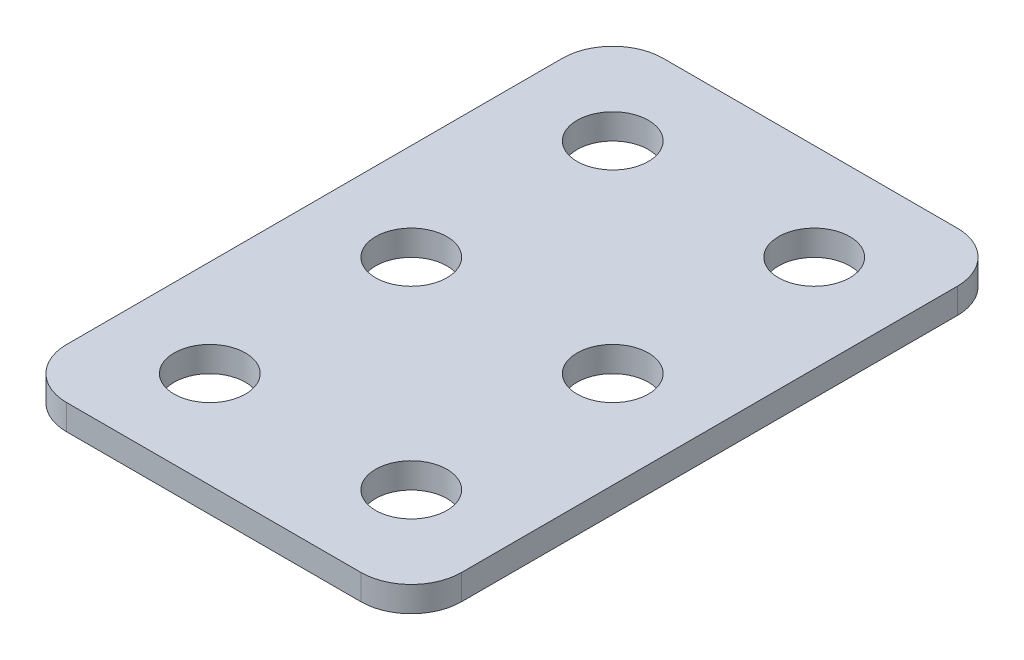
ISO-10303-21;
HEADER;
FILE_DESCRIPTION(('STEP AP214'),'2;1');
FILE_NAME('part.step','',(''),(''),'','','');
FILE_SCHEMA(('AUTOMOTIVE_DESIGN { 1 0 10303 214 1 1 1 1 }'));
ENDSEC;
DATA;
#1=APPLICATION_CONTEXT('core data for automotive mechanical design processes');
#2=APPLICATION_PROTOCOL_DEFINITION('international standard','automotive_design',2000,#1);
#3=PRODUCT_CONTEXT('',#1,'mechanical');
#4=PRODUCT('Part','Part','',(#3));
#5=PRODUCT_RELATED_PRODUCT_CATEGORY('part','',(#4));
#6=PRODUCT_DEFINITION_FORMATION('','',#4);
#7=PRODUCT_DEFINITION_CONTEXT('part definition',#1,'design');
#8=PRODUCT_DEFINITION('design','',#6,#7);
#9=PRODUCT_DEFINITION_SHAPE('','',#8);
#10=(LENGTH_UNIT() NAMED_UNIT(*) SI_UNIT(.MILLI.,.METRE.));
#11=(NAMED_UNIT(*) PLANE_ANGLE_UNIT() SI_UNIT($,.RADIAN.));
#12=(NAMED_UNIT(*) SI_UNIT($,.STERADIAN.) SOLID_ANGLE_UNIT());
#13=UNCERTAINTY_MEASURE_WITH_UNIT(LENGTH_MEASURE(1.E-05),#10,'distance_accuracy_value','');
#14=(GEOMETRIC_REPRESENTATION_CONTEXT(3) GLOBAL_UNCERTAINTY_ASSIGNED_CONTEXT((#13)) GLOBAL_UNIT_ASSIGNED_CONTEXT((#10,
#11,#12)) REPRESENTATION_CONTEXT('',''));
#15=CARTESIAN_POINT('',(0.,0.,0.));
#16=DIRECTION('',(0.,0.,1.));
#17=DIRECTION('',(1.,0.,0.));
#18=AXIS2_PLACEMENT_3D('',#15,#16,#17);
#19=CARTESIAN_POINT('',(0.,-9.5123,0.));
#20=DIRECTION('',(0.,-1.,0.));
#21=DIRECTION('',(1.,0.,0.));
#22=AXIS2_PLACEMENT_3D('',#19,#20,#21);
#23=PLANE('',#22);
#24=CARTESIAN_POINT('',(-6.35,-9.5123,-12.7));
#25=DIRECTION('',(0.,1.,0.));
#26=DIRECTION('',(-1.,0.,0.));
#27=AXIS2_PLACEMENT_3D('',#24,#25,#26);
#28=CIRCLE('',#27,2.2479);
#29=CARTESIAN_POINT('',(-8.5979,-9.5123,-12.7));
#30=VERTEX_POINT('',#29);
#31=EDGE_CURVE('E125',#30,#30,#28,.T.);
#32=ORIENTED_EDGE('',*,*,#31,.F.);
#33=EDGE_LOOP('',(#32));
#34=FACE_BOUND('',#33,.T.);
#35=CARTESIAN_POINT('',(6.35,-9.5123,-12.7));
#36=DIRECTION('',(0.,1.,0.));
#37=DIRECTION('',(-1.,0.,0.));
#38=AXIS2_PLACEMENT_3D('',#35,#36,#37);
#39=CIRCLE('',#38,2.2479);
#40=CARTESIAN_POINT('',(4.1021,-9.5123,-12.7));
#41=VERTEX_POINT('',#40);
#42=EDGE_CURVE('E185',#41,#41,#39,.T.);
#43=ORIENTED_EDGE('',*,*,#42,.F.);
#44=EDGE_LOOP('',(#43));
#45=FACE_BOUND('',#44,.T.);
#46=CARTESIAN_POINT('',(-6.35,-9.5123,-25.4));
#47=DIRECTION('',(0.,1.,0.));
#48=DIRECTION('',(-1.,0.,0.));
#49=AXIS2_PLACEMENT_3D('',#46,#47,#48);
#50=CIRCLE('',#49,2.2479);
#51=CARTESIAN_POINT('',(-8.5979,-9.5123,-25.4));
#52=VERTEX_POINT('',#51);
#53=EDGE_CURVE('E181',#52,#52,#50,.T.);
#54=ORIENTED_EDGE('',*,*,#53,.F.);
#55=EDGE_LOOP('',(#54));
#56=FACE_BOUND('',#55,.T.);
#57=CARTESIAN_POINT('',(6.35,-9.5123,-25.4));
#58=DIRECTION('',(0.,1.,0.));
#59=DIRECTION('',(-1.,0.,0.));
#60=AXIS2_PLACEMENT_3D('',#57,#58,#59);
#61=CIRCLE('',#60,2.2479);
#62=CARTESIAN_POINT('',(4.1021,-9.5123,-25.4));
#63=VERTEX_POINT('',#62);
#64=EDGE_CURVE('E177',#63,#63,#61,.T.);
#65=ORIENTED_EDGE('',*,*,#64,.F.);
#66=EDGE_LOOP('',(#65));
#67=FACE_BOUND('',#66,.T.);
#68=CARTESIAN_POINT('',(-6.35,-9.5123,-38.1));
#69=DIRECTION('',(0.,1.,0.));
#70=DIRECTION('',(-1.,0.,0.));
#71=AXIS2_PLACEMENT_3D('',#68,#69,#70);
#72=CIRCLE('',#71,2.2479);
#73=CARTESIAN_POINT('',(-8.5979,-9.5123,-38.1));
#74=VERTEX_POINT('',#73);
#75=EDGE_CURVE('E173',#74,#74,#72,.T.);
#76=ORIENTED_EDGE('',*,*,#75,.F.);
#77=EDGE_LOOP('',(#76));
#78=FACE_BOUND('',#77,.T.);
#79=CARTESIAN_POINT('',(6.35,-9.5123,-38.1));
#80=DIRECTION('',(0.,1.,0.));
#81=DIRECTION('',(-1.,0.,0.));
#82=AXIS2_PLACEMENT_3D('',#79,#80,#81);
#83=CIRCLE('',#82,2.2479);
#84=CARTESIAN_POINT('',(4.1021,-9.5123,-38.1));
#85=VERTEX_POINT('',#84);
#86=EDGE_CURVE('E158',#85,#85,#83,.T.);
#87=ORIENTED_EDGE('',*,*,#86,.F.);
#88=EDGE_LOOP('',(#87));
#89=FACE_BOUND('',#88,.T.);
#90=DIRECTION('',(0.,0.,-1.));
#91=VECTOR('',#90,1.);
#92=CARTESIAN_POINT('',(12.446,-9.5123,-6.604));
#93=LINE('',#92,#91);
#94=CARTESIAN_POINT('',(12.446,-9.5123,-9.779));
#95=VERTEX_POINT('',#94);
#96=CARTESIAN_POINT('',(12.446,-9.5123,-41.021));
#97=VERTEX_POINT('',#96);
#98=EDGE_CURVE('E104',#95,#97,#93,.T.);
#99=ORIENTED_EDGE('',*,*,#98,.T.);
#100=CARTESIAN_POINT('',(9.271,-9.5123,-41.021));
#101=DIRECTION('',(0.,-1.,0.));
#102=DIRECTION('',(1.,0.,0.));
#103=AXIS2_PLACEMENT_3D('',#100,#101,#102);
#104=CIRCLE('',#103,3.175);
#105=CARTESIAN_POINT('',(9.271,-9.5123,-44.196));
#106=VERTEX_POINT('',#105);
#107=EDGE_CURVE('E134',#97,#106,#104,.F.);
#108=ORIENTED_EDGE('',*,*,#107,.T.);
#109=DIRECTION('',(-1.,0.,0.));
#110=VECTOR('',#109,1.);
#111=CARTESIAN_POINT('',(12.446,-9.5123,-44.196));
#112=LINE('',#111,#110);
#113=CARTESIAN_POINT('',(-9.271,-9.5123,-44.196));
#114=VERTEX_POINT('',#113);
#115=EDGE_CURVE('E164',#106,#114,#112,.T.);
#116=ORIENTED_EDGE('',*,*,#115,.T.);
#117=CARTESIAN_POINT('',(-9.271,-9.5123,-41.021));
#118=DIRECTION('',(0.,-1.,0.));
#119=DIRECTION('',(1.,0.,0.));
#120=AXIS2_PLACEMENT_3D('',#117,#118,#119);
#121=CIRCLE('',#120,3.175);
#122=CARTESIAN_POINT('',(-12.446,-9.5123,-41.021));
#123=VERTEX_POINT('',#122);
#124=EDGE_CURVE('E132',#114,#123,#121,.F.);
#125=ORIENTED_EDGE('',*,*,#124,.T.);
#126=DIRECTION('',(0.,0.,1.));
#127=VECTOR('',#126,1.);
#128=CARTESIAN_POINT('',(-12.446,-9.5123,-44.196));
#129=LINE('',#128,#127);
#130=CARTESIAN_POINT('',(-12.446,-9.5123,-9.779));
#131=VERTEX_POINT('',#130);
#132=EDGE_CURVE('E167',#123,#131,#129,.T.);
#133=ORIENTED_EDGE('',*,*,#132,.T.);
#134=CARTESIAN_POINT('',(-9.27099999999999,-9.5123,-9.779));
#135=DIRECTION('',(0.,-1.,0.));
#136=DIRECTION('',(1.,0.,0.));
#137=AXIS2_PLACEMENT_3D('',#134,#135,#136);
#138=CIRCLE('',#137,3.175);
#139=CARTESIAN_POINT('',(-9.27099999999999,-9.5123,-6.604));
#140=VERTEX_POINT('',#139);
#141=EDGE_CURVE('E110',#131,#140,#138,.F.);
#142=ORIENTED_EDGE('',*,*,#141,.T.);
#143=DIRECTION('',(1.,0.,0.));
#144=VECTOR('',#143,1.);
#145=CARTESIAN_POINT('',(-12.446,-9.5123,-6.604));
#146=LINE('',#145,#144);
#147=CARTESIAN_POINT('',(9.271,-9.5123,-6.604));
#148=VERTEX_POINT('',#147);
#149=EDGE_CURVE('E105',#140,#148,#146,.T.);
#150=ORIENTED_EDGE('',*,*,#149,.T.);
#151=CARTESIAN_POINT('',(9.271,-9.5123,-9.779));
#152=DIRECTION('',(0.,-1.,0.));
#153=DIRECTION('',(1.,0.,0.));
#154=AXIS2_PLACEMENT_3D('',#151,#152,#153);
#155=CIRCLE('',#154,3.175);
#156=EDGE_CURVE('E102',#148,#95,#155,.F.);
#157=ORIENTED_EDGE('',*,*,#156,.T.);
#158=EDGE_LOOP('',(#99,#108,#116,#125,#133,#142,#150,#157));
#159=FACE_BOUND('',#158,.T.);
#160=ADVANCED_FACE('F37',(#34,#45,#56,#67,#78,#89,#159),#23,.F.);
#161=CARTESIAN_POINT('',(0.,-11.1125,0.));
#162=DIRECTION('',(0.,-1.,0.));
#163=DIRECTION('',(1.,0.,0.));
#164=AXIS2_PLACEMENT_3D('',#161,#162,#163);
#165=PLANE('',#164);
#166=CARTESIAN_POINT('',(-6.35,-11.1125,-12.7));
#167=DIRECTION('',(0.,-1.,0.));
#168=DIRECTION('',(1.,0.,0.));
#169=AXIS2_PLACEMENT_3D('',#166,#167,#168);
#170=CIRCLE('',#169,2.2479);
#171=CARTESIAN_POINT('',(-4.1021,-11.1125,-12.7));
#172=VERTEX_POINT('',#171);
#173=EDGE_CURVE('E121',#172,#172,#170,.T.);
#174=ORIENTED_EDGE('',*,*,#173,.F.);
#175=EDGE_LOOP('',(#174));
#176=FACE_BOUND('',#175,.T.);
#177=CARTESIAN_POINT('',(6.35,-11.1125,-12.7));
#178=DIRECTION('',(0.,-1.,0.));
#179=DIRECTION('',(1.,0.,0.));
#180=AXIS2_PLACEMENT_3D('',#177,#178,#179);
#181=CIRCLE('',#180,2.2479);
#182=CARTESIAN_POINT('',(8.5979,-11.1125,-12.7));
#183=VERTEX_POINT('',#182);
#184=EDGE_CURVE('E188',#183,#183,#181,.T.);
#185=ORIENTED_EDGE('',*,*,#184,.F.);
#186=EDGE_LOOP('',(#185));
#187=FACE_BOUND('',#186,.T.);
#188=CARTESIAN_POINT('',(-6.35,-11.1125,-25.4));
#189=DIRECTION('',(0.,-1.,0.));
#190=DIRECTION('',(1.,0.,0.));
#191=AXIS2_PLACEMENT_3D('',#188,#189,#190);
#192=CIRCLE('',#191,2.2479);
#193=CARTESIAN_POINT('',(-4.1021,-11.1125,-25.4));
#194=VERTEX_POINT('',#193);
#195=EDGE_CURVE('E184',#194,#194,#192,.T.);
#196=ORIENTED_EDGE('',*,*,#195,.F.);
#197=EDGE_LOOP('',(#196));
#198=FACE_BOUND('',#197,.T.);
#199=CARTESIAN_POINT('',(6.35,-11.1125,-25.4));
#200=DIRECTION('',(0.,-1.,0.));
#201=DIRECTION('',(1.,0.,0.));
#202=AXIS2_PLACEMENT_3D('',#199,#200,#201);
#203=CIRCLE('',#202,2.2479);
#204=CARTESIAN_POINT('',(8.5979,-11.1125,-25.4));
#205=VERTEX_POINT('',#204);
#206=EDGE_CURVE('E180',#205,#205,#203,.T.);
#207=ORIENTED_EDGE('',*,*,#206,.F.);
#208=EDGE_LOOP('',(#207));
#209=FACE_BOUND('',#208,.T.);
#210=CARTESIAN_POINT('',(-6.35,-11.1125,-38.1));
#211=DIRECTION('',(0.,-1.,0.));
#212=DIRECTION('',(1.,0.,0.));
#213=AXIS2_PLACEMENT_3D('',#210,#211,#212);
#214=CIRCLE('',#213,2.2479);
#215=CARTESIAN_POINT('',(-4.1021,-11.1125,-38.1));
#216=VERTEX_POINT('',#215);
#217=EDGE_CURVE('E176',#216,#216,#214,.T.);
#218=ORIENTED_EDGE('',*,*,#217,.F.);
#219=EDGE_LOOP('',(#218));
#220=FACE_BOUND('',#219,.T.);
#221=CARTESIAN_POINT('',(6.35,-11.1125,-38.1));
#222=DIRECTION('',(0.,-1.,0.));
#223=DIRECTION('',(1.,0.,0.));
#224=AXIS2_PLACEMENT_3D('',#221,#222,#223);
#225=CIRCLE('',#224,2.2479);
#226=CARTESIAN_POINT('',(8.5979,-11.1125,-38.1));
#227=VERTEX_POINT('',#226);
#228=EDGE_CURVE('E128',#227,#227,#225,.T.);
#229=ORIENTED_EDGE('',*,*,#228,.F.);
#230=EDGE_LOOP('',(#229));
#231=FACE_BOUND('',#230,.T.);
#232=DIRECTION('',(-1.,0.,0.));
#233=VECTOR('',#232,1.);
#234=CARTESIAN_POINT('',(12.446,-11.1125,-44.196));
#235=LINE('',#234,#233);
#236=CARTESIAN_POINT('',(9.271,-11.1125,-44.196));
#237=VERTEX_POINT('',#236);
#238=CARTESIAN_POINT('',(-9.271,-11.1125,-44.196));
#239=VERTEX_POINT('',#238);
#240=EDGE_CURVE('E119',#237,#239,#235,.T.);
#241=ORIENTED_EDGE('',*,*,#240,.F.);
#242=CARTESIAN_POINT('',(9.271,-11.1125,-41.021));
#243=DIRECTION('',(0.,-1.,0.));
#244=DIRECTION('',(1.,0.,0.));
#245=AXIS2_PLACEMENT_3D('',#242,#243,#244);
#246=CIRCLE('',#245,3.175);
#247=CARTESIAN_POINT('',(12.446,-11.1125,-41.021));
#248=VERTEX_POINT('',#247);
#249=EDGE_CURVE('E146',#237,#248,#246,.T.);
#250=ORIENTED_EDGE('',*,*,#249,.T.);
#251=DIRECTION('',(0.,0.,-1.));
#252=VECTOR('',#251,1.);
#253=CARTESIAN_POINT('',(12.446,-11.1125,-6.604));
#254=LINE('',#253,#252);
#255=CARTESIAN_POINT('',(12.446,-11.1125,-9.779));
#256=VERTEX_POINT('',#255);
#257=EDGE_CURVE('E155',#256,#248,#254,.T.);
#258=ORIENTED_EDGE('',*,*,#257,.F.);
#259=CARTESIAN_POINT('',(9.271,-11.1125,-9.779));
#260=DIRECTION('',(0.,-1.,0.));
#261=DIRECTION('',(1.,0.,0.));
#262=AXIS2_PLACEMENT_3D('',#259,#260,#261);
#263=CIRCLE('',#262,3.175);
#264=CARTESIAN_POINT('',(9.271,-11.1125,-6.604));
#265=VERTEX_POINT('',#264);
#266=EDGE_CURVE('E52',#256,#265,#263,.T.);
#267=ORIENTED_EDGE('',*,*,#266,.T.);
#268=DIRECTION('',(1.,0.,0.));
#269=VECTOR('',#268,1.);
#270=CARTESIAN_POINT('',(-12.446,-11.1125,-6.604));
#271=LINE('',#270,#269);
#272=CARTESIAN_POINT('',(-9.27099999999999,-11.1125,-6.604));
#273=VERTEX_POINT('',#272);
#274=EDGE_CURVE('E153',#273,#265,#271,.T.);
#275=ORIENTED_EDGE('',*,*,#274,.F.);
#276=CARTESIAN_POINT('',(-9.27099999999999,-11.1125,-9.779));
#277=DIRECTION('',(0.,-1.,0.));
#278=DIRECTION('',(1.,0.,0.));
#279=AXIS2_PLACEMENT_3D('',#276,#277,#278);
#280=CIRCLE('',#279,3.175);
#281=CARTESIAN_POINT('',(-12.446,-11.1125,-9.779));
#282=VERTEX_POINT('',#281);
#283=EDGE_CURVE('E142',#273,#282,#280,.T.);
#284=ORIENTED_EDGE('',*,*,#283,.T.);
#285=DIRECTION('',(0.,0.,1.));
#286=VECTOR('',#285,1.);
#287=CARTESIAN_POINT('',(-12.446,-11.1125,-44.196));
#288=LINE('',#287,#286);
#289=CARTESIAN_POINT('',(-12.446,-11.1125,-41.021));
#290=VERTEX_POINT('',#289);
#291=EDGE_CURVE('E156',#290,#282,#288,.T.);
#292=ORIENTED_EDGE('',*,*,#291,.F.);
#293=CARTESIAN_POINT('',(-9.271,-11.1125,-41.021));
#294=DIRECTION('',(0.,-1.,0.));
#295=DIRECTION('',(1.,0.,0.));
#296=AXIS2_PLACEMENT_3D('',#293,#294,#295);
#297=CIRCLE('',#296,3.175);
#298=EDGE_CURVE('E144',#290,#239,#297,.T.);
#299=ORIENTED_EDGE('',*,*,#298,.T.);
#300=EDGE_LOOP('',(#241,#250,#258,#267,#275,#284,#292,#299));
#301=FACE_BOUND('',#300,.T.);
#302=ADVANCED_FACE('F202',(#176,#187,#198,#209,#220,#231,#301),#165,.T.);
#303=CARTESIAN_POINT('',(-6.35,-19.05,-12.7));
#304=DIRECTION('',(0.,1.,0.));
#305=DIRECTION('',(-1.,0.,0.));
#306=AXIS2_PLACEMENT_3D('',#303,#304,#305);
#307=CYLINDRICAL_SURFACE('',#306,2.2479);
#308=ORIENTED_EDGE('',*,*,#173,.T.);
#309=EDGE_LOOP('',(#308));
#310=FACE_BOUND('',#309,.T.);
#311=ORIENTED_EDGE('',*,*,#31,.T.);
#312=EDGE_LOOP('',(#311));
#313=FACE_BOUND('',#312,.T.);
#314=ADVANCED_FACE('F205',(#310,#313),#307,.F.);
#315=CARTESIAN_POINT('',(6.35,-19.05,-12.7));
#316=DIRECTION('',(0.,1.,0.));
#317=DIRECTION('',(-1.,0.,0.));
#318=AXIS2_PLACEMENT_3D('',#315,#316,#317);
#319=CYLINDRICAL_SURFACE('',#318,2.2479);
#320=ORIENTED_EDGE('',*,*,#184,.T.);
#321=EDGE_LOOP('',(#320));
#322=FACE_BOUND('',#321,.T.);
#323=ORIENTED_EDGE('',*,*,#42,.T.);
#324=EDGE_LOOP('',(#323));
#325=FACE_BOUND('',#324,.T.);
#326=ADVANCED_FACE('F272',(#322,#325),#319,.F.);
#327=CARTESIAN_POINT('',(-6.35,-19.05,-25.4));
#328=DIRECTION('',(0.,1.,0.));
#329=DIRECTION('',(-1.,0.,0.));
#330=AXIS2_PLACEMENT_3D('',#327,#328,#329);
#331=CYLINDRICAL_SURFACE('',#330,2.2479);
#332=ORIENTED_EDGE('',*,*,#195,.T.);
#333=EDGE_LOOP('',(#332));
#334=FACE_BOUND('',#333,.T.);
#335=ORIENTED_EDGE('',*,*,#53,.T.);
#336=EDGE_LOOP('',(#335));
#337=FACE_BOUND('',#336,.T.);
#338=ADVANCED_FACE('F269',(#334,#337),#331,.F.);
#339=CARTESIAN_POINT('',(6.35,-19.05,-25.4));
#340=DIRECTION('',(0.,1.,0.));
#341=DIRECTION('',(-1.,0.,0.));
#342=AXIS2_PLACEMENT_3D('',#339,#340,#341);
#343=CYLINDRICAL_SURFACE('',#342,2.2479);
#344=ORIENTED_EDGE('',*,*,#206,.T.);
#345=EDGE_LOOP('',(#344));
#346=FACE_BOUND('',#345,.T.);
#347=ORIENTED_EDGE('',*,*,#64,.T.);
#348=EDGE_LOOP('',(#347));
#349=FACE_BOUND('',#348,.T.);
#350=ADVANCED_FACE('F266',(#346,#349),#343,.F.);
#351=CARTESIAN_POINT('',(-6.35,-19.05,-38.1));
#352=DIRECTION('',(0.,1.,0.));
#353=DIRECTION('',(-1.,0.,0.));
#354=AXIS2_PLACEMENT_3D('',#351,#352,#353);
#355=CYLINDRICAL_SURFACE('',#354,2.2479);
#356=ORIENTED_EDGE('',*,*,#217,.T.);
#357=EDGE_LOOP('',(#356));
#358=FACE_BOUND('',#357,.T.);
#359=ORIENTED_EDGE('',*,*,#75,.T.);
#360=EDGE_LOOP('',(#359));
#361=FACE_BOUND('',#360,.T.);
#362=ADVANCED_FACE('F199',(#358,#361),#355,.F.);
#363=CARTESIAN_POINT('',(6.35,-19.05,-38.1));
#364=DIRECTION('',(0.,1.,0.));
#365=DIRECTION('',(-1.,0.,0.));
#366=AXIS2_PLACEMENT_3D('',#363,#364,#365);
#367=CYLINDRICAL_SURFACE('',#366,2.2479);
#368=ORIENTED_EDGE('',*,*,#228,.T.);
#369=EDGE_LOOP('',(#368));
#370=FACE_BOUND('',#369,.T.);
#371=ORIENTED_EDGE('',*,*,#86,.T.);
#372=EDGE_LOOP('',(#371));
#373=FACE_BOUND('',#372,.T.);
#374=ADVANCED_FACE('F260',(#370,#373),#367,.F.);
#375=CARTESIAN_POINT('',(12.446,-11.1125,-44.196));
#376=DIRECTION('',(0.,0.,-1.));
#377=DIRECTION('',(-1.,0.,0.));
#378=AXIS2_PLACEMENT_3D('',#375,#376,#377);
#379=PLANE('',#378);
#380=ORIENTED_EDGE('',*,*,#115,.F.);
#381=DIRECTION('',(0.,1.,0.));
#382=VECTOR('',#381,1.);
#383=CARTESIAN_POINT('',(9.271,-11.1125,-44.196));
#384=LINE('',#383,#382);
#385=EDGE_CURVE('E139',#106,#237,#384,.F.);
#386=ORIENTED_EDGE('',*,*,#385,.T.);
#387=ORIENTED_EDGE('',*,*,#240,.T.);
#388=DIRECTION('',(0.,1.,0.));
#389=VECTOR('',#388,1.);
#390=CARTESIAN_POINT('',(-9.271,-11.1125,-44.196));
#391=LINE('',#390,#389);
#392=EDGE_CURVE('E136',#239,#114,#391,.T.);
#393=ORIENTED_EDGE('',*,*,#392,.T.);
#394=EDGE_LOOP('',(#380,#386,#387,#393));
#395=FACE_BOUND('',#394,.T.);
#396=ADVANCED_FACE('F221',(#395),#379,.T.);
#397=CARTESIAN_POINT('',(12.446,-11.1125,-6.604));
#398=DIRECTION('',(1.,0.,0.));
#399=DIRECTION('',(0.,1.,0.));
#400=AXIS2_PLACEMENT_3D('',#397,#398,#399);
#401=PLANE('',#400);
#402=ORIENTED_EDGE('',*,*,#257,.T.);
#403=DIRECTION('',(0.,1.,0.));
#404=VECTOR('',#403,1.);
#405=CARTESIAN_POINT('',(12.446,-11.1125,-41.021));
#406=LINE('',#405,#404);
#407=EDGE_CURVE('E111',#248,#97,#406,.T.);
#408=ORIENTED_EDGE('',*,*,#407,.T.);
#409=ORIENTED_EDGE('',*,*,#98,.F.);
#410=DIRECTION('',(0.,1.,0.));
#411=VECTOR('',#410,1.);
#412=CARTESIAN_POINT('',(12.446,-11.1125,-9.779));
#413=LINE('',#412,#411);
#414=EDGE_CURVE('E117',#95,#256,#413,.F.);
#415=ORIENTED_EDGE('',*,*,#414,.T.);
#416=EDGE_LOOP('',(#402,#408,#409,#415));
#417=FACE_BOUND('',#416,.T.);
#418=ADVANCED_FACE('F116',(#417),#401,.T.);
#419=CARTESIAN_POINT('',(-12.446,-11.1125,-6.604));
#420=DIRECTION('',(0.,0.,1.));
#421=DIRECTION('',(1.,0.,0.));
#422=AXIS2_PLACEMENT_3D('',#419,#420,#421);
#423=PLANE('',#422);
#424=ORIENTED_EDGE('',*,*,#149,.F.);
#425=DIRECTION('',(0.,1.,0.));
#426=VECTOR('',#425,1.);
#427=CARTESIAN_POINT('',(-9.27099999999999,-11.1125,-6.604));
#428=LINE('',#427,#426);
#429=EDGE_CURVE('E11',#140,#273,#428,.F.);
#430=ORIENTED_EDGE('',*,*,#429,.T.);
#431=ORIENTED_EDGE('',*,*,#274,.T.);
#432=DIRECTION('',(0.,1.,0.));
#433=VECTOR('',#432,1.);
#434=CARTESIAN_POINT('',(9.271,-11.1125,-6.604));
#435=LINE('',#434,#433);
#436=EDGE_CURVE('E45',#265,#148,#435,.T.);
#437=ORIENTED_EDGE('',*,*,#436,.T.);
#438=EDGE_LOOP('',(#424,#430,#431,#437));
#439=FACE_BOUND('',#438,.T.);
#440=ADVANCED_FACE('F152',(#439),#423,.T.);
#441=CARTESIAN_POINT('',(-12.446,-11.1125,-44.196));
#442=DIRECTION('',(-1.,0.,0.));
#443=DIRECTION('',(0.,-1.,0.));
#444=AXIS2_PLACEMENT_3D('',#441,#442,#443);
#445=PLANE('',#444);
#446=ORIENTED_EDGE('',*,*,#132,.F.);
#447=DIRECTION('',(0.,1.,0.));
#448=VECTOR('',#447,1.);
#449=CARTESIAN_POINT('',(-12.446,-11.1125,-41.021));
#450=LINE('',#449,#448);
#451=EDGE_CURVE('E151',#123,#290,#450,.F.);
#452=ORIENTED_EDGE('',*,*,#451,.T.);
#453=ORIENTED_EDGE('',*,*,#291,.T.);
#454=DIRECTION('',(0.,1.,0.));
#455=VECTOR('',#454,1.);
#456=CARTESIAN_POINT('',(-12.446,-11.1125,-9.779));
#457=LINE('',#456,#455);
#458=EDGE_CURVE('E148',#282,#131,#457,.T.);
#459=ORIENTED_EDGE('',*,*,#458,.T.);
#460=EDGE_LOOP('',(#446,#452,#453,#459));
#461=FACE_BOUND('',#460,.T.);
#462=ADVANCED_FACE('F227',(#461),#445,.T.);
#463=CARTESIAN_POINT('',(9.271,-11.1125,-41.021));
#464=DIRECTION('',(0.,1.,0.));
#465=DIRECTION('',(-1.,0.,0.));
#466=AXIS2_PLACEMENT_3D('',#463,#464,#465);
#467=CYLINDRICAL_SURFACE('',#466,3.175);
#468=ORIENTED_EDGE('',*,*,#249,.F.);
#469=ORIENTED_EDGE('',*,*,#385,.F.);
#470=ORIENTED_EDGE('',*,*,#107,.F.);
#471=ORIENTED_EDGE('',*,*,#407,.F.);
#472=EDGE_LOOP('',(#468,#469,#470,#471));
#473=FACE_BOUND('',#472,.T.);
#474=ADVANCED_FACE('F219',(#473),#467,.T.);
#475=CARTESIAN_POINT('',(-9.271,-11.1125,-41.021));
#476=DIRECTION('',(0.,1.,0.));
#477=DIRECTION('',(-1.,0.,0.));
#478=AXIS2_PLACEMENT_3D('',#475,#476,#477);
#479=CYLINDRICAL_SURFACE('',#478,3.175);
#480=ORIENTED_EDGE('',*,*,#298,.F.);
#481=ORIENTED_EDGE('',*,*,#451,.F.);
#482=ORIENTED_EDGE('',*,*,#124,.F.);
#483=ORIENTED_EDGE('',*,*,#392,.F.);
#484=EDGE_LOOP('',(#480,#481,#482,#483));
#485=FACE_BOUND('',#484,.T.);
#486=ADVANCED_FACE('F223',(#485),#479,.T.);
#487=CARTESIAN_POINT('',(-9.27099999999999,-11.1125,-9.779));
#488=DIRECTION('',(0.,1.,0.));
#489=DIRECTION('',(-1.,0.,0.));
#490=AXIS2_PLACEMENT_3D('',#487,#488,#489);
#491=CYLINDRICAL_SURFACE('',#490,3.175);
#492=ORIENTED_EDGE('',*,*,#283,.F.);
#493=ORIENTED_EDGE('',*,*,#429,.F.);
#494=ORIENTED_EDGE('',*,*,#141,.F.);
#495=ORIENTED_EDGE('',*,*,#458,.F.);
#496=EDGE_LOOP('',(#492,#493,#494,#495));
#497=FACE_BOUND('',#496,.T.);
#498=ADVANCED_FACE('F230',(#497),#491,.T.);
#499=CARTESIAN_POINT('',(9.271,-11.1125,-9.779));
#500=DIRECTION('',(0.,1.,0.));
#501=DIRECTION('',(-1.,0.,0.));
#502=AXIS2_PLACEMENT_3D('',#499,#500,#501);
#503=CYLINDRICAL_SURFACE('',#502,3.175);
#504=ORIENTED_EDGE('',*,*,#266,.F.);
#505=ORIENTED_EDGE('',*,*,#414,.F.);
#506=ORIENTED_EDGE('',*,*,#156,.F.);
#507=ORIENTED_EDGE('',*,*,#436,.F.);
#508=EDGE_LOOP('',(#504,#505,#506,#507));
#509=FACE_BOUND('',#508,.T.);
#510=ADVANCED_FACE('F39',(#509),#503,.T.);
#511=CLOSED_SHELL('',(#160,#302,#314,#326,#338,#350,#362,#374,#396,#418,#440,#462,#474,#486,
#498,#510));
#512=MANIFOLD_SOLID_BREP('B2',#511);
#513=ADVANCED_BREP_SHAPE_REPRESENTATION('',(#18,#512),#14);
#514=SHAPE_DEFINITION_REPRESENTATION(#9,#513);
ENDSEC;
END-ISO-10303-21;
